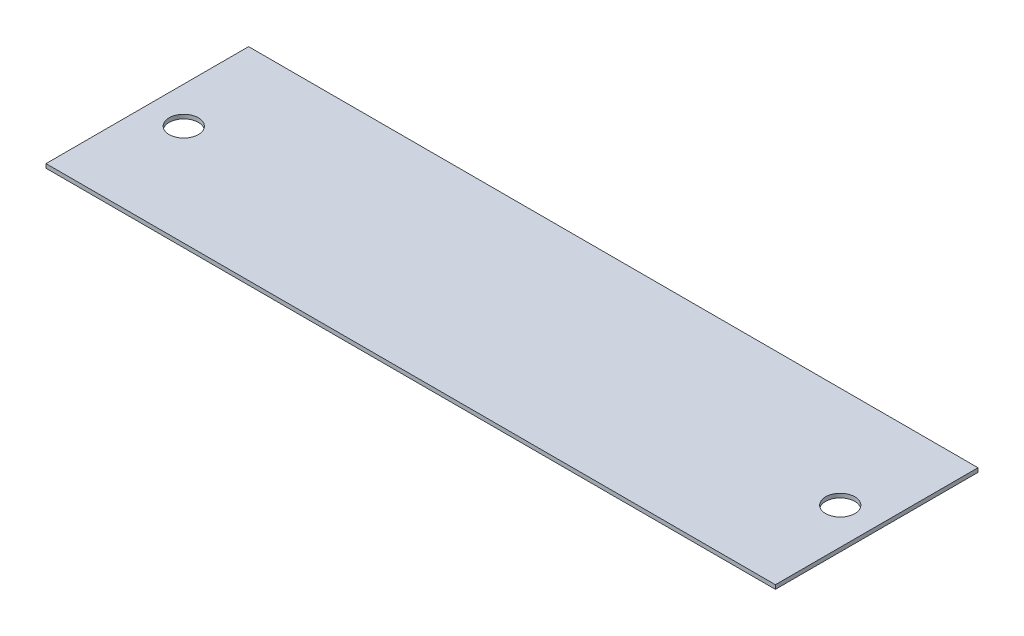
ISO-10303-21;
HEADER;
FILE_DESCRIPTION(('STEP AP214'),'2;1');
FILE_NAME('part.step','',(''),(''),'','','');
FILE_SCHEMA(('AUTOMOTIVE_DESIGN { 1 0 10303 214 1 1 1 1 }'));
ENDSEC;
DATA;
#1=APPLICATION_CONTEXT('core data for automotive mechanical design processes');
#2=APPLICATION_PROTOCOL_DEFINITION('international standard','automotive_design',2000,#1);
#3=PRODUCT_CONTEXT('',#1,'mechanical');
#4=PRODUCT('Part','Part','',(#3));
#5=PRODUCT_RELATED_PRODUCT_CATEGORY('part','',(#4));
#6=PRODUCT_DEFINITION_FORMATION('','',#4);
#7=PRODUCT_DEFINITION_CONTEXT('part definition',#1,'design');
#8=PRODUCT_DEFINITION('design','',#6,#7);
#9=PRODUCT_DEFINITION_SHAPE('','',#8);
#10=(LENGTH_UNIT() NAMED_UNIT(*) SI_UNIT(.MILLI.,.METRE.));
#11=(NAMED_UNIT(*) PLANE_ANGLE_UNIT() SI_UNIT($,.RADIAN.));
#12=(NAMED_UNIT(*) SI_UNIT($,.STERADIAN.) SOLID_ANGLE_UNIT());
#13=UNCERTAINTY_MEASURE_WITH_UNIT(LENGTH_MEASURE(1.E-05),#10,'distance_accuracy_value','');
#14=(GEOMETRIC_REPRESENTATION_CONTEXT(3) GLOBAL_UNCERTAINTY_ASSIGNED_CONTEXT((#13)) GLOBAL_UNIT_ASSIGNED_CONTEXT((#10,
#11,#12)) REPRESENTATION_CONTEXT('',''));
#15=CARTESIAN_POINT('',(0.,0.,0.));
#16=DIRECTION('',(0.,0.,1.));
#17=DIRECTION('',(1.,0.,0.));
#18=AXIS2_PLACEMENT_3D('',#15,#16,#17);
#19=CARTESIAN_POINT('',(45.,0.5,-12.5));
#20=DIRECTION('',(-1.,0.,0.));
#21=DIRECTION('',(0.,0.,1.));
#22=AXIS2_PLACEMENT_3D('',#19,#20,#21);
#23=PLANE('',#22);
#24=DIRECTION('',(0.,0.,-1.));
#25=VECTOR('',#24,1.);
#26=CARTESIAN_POINT('',(45.,0.,-12.5));
#27=LINE('',#26,#25);
#28=CARTESIAN_POINT('',(45.,0.,12.5));
#29=VERTEX_POINT('',#28);
#30=CARTESIAN_POINT('',(45.,0.,-12.5));
#31=VERTEX_POINT('',#30);
#32=EDGE_CURVE('E107',#29,#31,#27,.T.);
#33=ORIENTED_EDGE('',*,*,#32,.T.);
#34=DIRECTION('',(0.,-1.,0.));
#35=VECTOR('',#34,1.);
#36=CARTESIAN_POINT('',(45.,0.5,-12.5));
#37=LINE('',#36,#35);
#38=CARTESIAN_POINT('',(45.,0.5,-12.5));
#39=VERTEX_POINT('',#38);
#40=EDGE_CURVE('E11',#39,#31,#37,.T.);
#41=ORIENTED_EDGE('',*,*,#40,.F.);
#42=DIRECTION('',(0.,0.,-1.));
#43=VECTOR('',#42,1.);
#44=CARTESIAN_POINT('',(45.,0.5,-12.5));
#45=LINE('',#44,#43);
#46=CARTESIAN_POINT('',(45.,0.5,12.5));
#47=VERTEX_POINT('',#46);
#48=EDGE_CURVE('E91',#47,#39,#45,.T.);
#49=ORIENTED_EDGE('',*,*,#48,.F.);
#50=DIRECTION('',(0.,-1.,0.));
#51=VECTOR('',#50,1.);
#52=CARTESIAN_POINT('',(45.,0.5,12.5));
#53=LINE('',#52,#51);
#54=EDGE_CURVE('E103',#47,#29,#53,.T.);
#55=ORIENTED_EDGE('',*,*,#54,.T.);
#56=EDGE_LOOP('',(#33,#41,#49,#55));
#57=FACE_BOUND('',#56,.T.);
#58=ADVANCED_FACE('F39',(#57),#23,.F.);
#59=CARTESIAN_POINT('',(-45.,0.5,-12.5));
#60=DIRECTION('',(0.,0.,1.));
#61=DIRECTION('',(1.,0.,0.));
#62=AXIS2_PLACEMENT_3D('',#59,#60,#61);
#63=PLANE('',#62);
#64=DIRECTION('',(-1.,0.,0.));
#65=VECTOR('',#64,1.);
#66=CARTESIAN_POINT('',(-45.,0.,-12.5));
#67=LINE('',#66,#65);
#68=CARTESIAN_POINT('',(-45.,0.,-12.5));
#69=VERTEX_POINT('',#68);
#70=EDGE_CURVE('E96',#31,#69,#67,.T.);
#71=ORIENTED_EDGE('',*,*,#70,.T.);
#72=DIRECTION('',(0.,-1.,0.));
#73=VECTOR('',#72,1.);
#74=CARTESIAN_POINT('',(-45.,0.5,-12.5));
#75=LINE('',#74,#73);
#76=CARTESIAN_POINT('',(-45.,0.5,-12.5));
#77=VERTEX_POINT('',#76);
#78=EDGE_CURVE('E48',#77,#69,#75,.T.);
#79=ORIENTED_EDGE('',*,*,#78,.F.);
#80=DIRECTION('',(-1.,0.,0.));
#81=VECTOR('',#80,1.);
#82=CARTESIAN_POINT('',(-45.,0.5,-12.5));
#83=LINE('',#82,#81);
#84=EDGE_CURVE('E86',#39,#77,#83,.T.);
#85=ORIENTED_EDGE('',*,*,#84,.F.);
#86=ORIENTED_EDGE('',*,*,#40,.T.);
#87=EDGE_LOOP('',(#71,#79,#85,#86));
#88=FACE_BOUND('',#87,.T.);
#89=ADVANCED_FACE('F95',(#88),#63,.F.);
#90=CARTESIAN_POINT('',(-45.,0.5,-12.5));
#91=DIRECTION('',(1.,0.,0.));
#92=DIRECTION('',(0.,0.,-1.));
#93=AXIS2_PLACEMENT_3D('',#90,#91,#92);
#94=PLANE('',#93);
#95=DIRECTION('',(0.,0.,1.));
#96=VECTOR('',#95,1.);
#97=CARTESIAN_POINT('',(-45.,0.,-12.5));
#98=LINE('',#97,#96);
#99=CARTESIAN_POINT('',(-45.,0.,12.5));
#100=VERTEX_POINT('',#99);
#101=EDGE_CURVE('E73',#69,#100,#98,.T.);
#102=ORIENTED_EDGE('',*,*,#101,.T.);
#103=DIRECTION('',(0.,-1.,0.));
#104=VECTOR('',#103,1.);
#105=CARTESIAN_POINT('',(-45.,0.5,12.5));
#106=LINE('',#105,#104);
#107=CARTESIAN_POINT('',(-45.,0.5,12.5));
#108=VERTEX_POINT('',#107);
#109=EDGE_CURVE('E98',#108,#100,#106,.T.);
#110=ORIENTED_EDGE('',*,*,#109,.F.);
#111=DIRECTION('',(0.,0.,1.));
#112=VECTOR('',#111,1.);
#113=CARTESIAN_POINT('',(-45.,0.5,-12.5));
#114=LINE('',#113,#112);
#115=EDGE_CURVE('E89',#77,#108,#114,.T.);
#116=ORIENTED_EDGE('',*,*,#115,.F.);
#117=ORIENTED_EDGE('',*,*,#78,.T.);
#118=EDGE_LOOP('',(#102,#110,#116,#117));
#119=FACE_BOUND('',#118,.T.);
#120=ADVANCED_FACE('F99',(#119),#94,.F.);
#121=CARTESIAN_POINT('',(-45.,0.5,12.5));
#122=DIRECTION('',(0.,0.,-1.));
#123=DIRECTION('',(-1.,0.,0.));
#124=AXIS2_PLACEMENT_3D('',#121,#122,#123);
#125=PLANE('',#124);
#126=DIRECTION('',(1.,0.,0.));
#127=VECTOR('',#126,1.);
#128=CARTESIAN_POINT('',(-45.,0.,12.5));
#129=LINE('',#128,#127);
#130=EDGE_CURVE('E79',#100,#29,#129,.T.);
#131=ORIENTED_EDGE('',*,*,#130,.T.);
#132=ORIENTED_EDGE('',*,*,#54,.F.);
#133=DIRECTION('',(1.,0.,0.));
#134=VECTOR('',#133,1.);
#135=CARTESIAN_POINT('',(-45.,0.5,12.5));
#136=LINE('',#135,#134);
#137=EDGE_CURVE('E56',#108,#47,#136,.T.);
#138=ORIENTED_EDGE('',*,*,#137,.F.);
#139=ORIENTED_EDGE('',*,*,#109,.T.);
#140=EDGE_LOOP('',(#131,#132,#138,#139));
#141=FACE_BOUND('',#140,.T.);
#142=ADVANCED_FACE('F121',(#141),#125,.F.);
#143=CARTESIAN_POINT('',(0.,0.5,0.));
#144=DIRECTION('',(0.,1.,0.));
#145=DIRECTION('',(0.,0.,1.));
#146=AXIS2_PLACEMENT_3D('',#143,#144,#145);
#147=PLANE('',#146);
#148=CARTESIAN_POINT('',(-40.5,0.5,0.));
#149=DIRECTION('',(0.,1.,0.));
#150=DIRECTION('',(0.,0.,1.));
#151=AXIS2_PLACEMENT_3D('',#148,#149,#150);
#152=CIRCLE('',#151,1.8);
#153=CARTESIAN_POINT('',(-40.5,0.5,1.8));
#154=VERTEX_POINT('',#153);
#155=EDGE_CURVE('E132',#154,#154,#152,.T.);
#156=ORIENTED_EDGE('',*,*,#155,.F.);
#157=EDGE_LOOP('',(#156));
#158=FACE_BOUND('',#157,.T.);
#159=CARTESIAN_POINT('',(40.5,0.5,0.));
#160=DIRECTION('',(0.,1.,0.));
#161=DIRECTION('',(0.,0.,1.));
#162=AXIS2_PLACEMENT_3D('',#159,#160,#161);
#163=CIRCLE('',#162,1.8);
#164=CARTESIAN_POINT('',(40.5,0.5,1.8));
#165=VERTEX_POINT('',#164);
#166=EDGE_CURVE('E133',#165,#165,#163,.T.);
#167=ORIENTED_EDGE('',*,*,#166,.F.);
#168=EDGE_LOOP('',(#167));
#169=FACE_BOUND('',#168,.T.);
#170=ORIENTED_EDGE('',*,*,#48,.T.);
#171=ORIENTED_EDGE('',*,*,#84,.T.);
#172=ORIENTED_EDGE('',*,*,#115,.T.);
#173=ORIENTED_EDGE('',*,*,#137,.T.);
#174=EDGE_LOOP('',(#170,#171,#172,#173));
#175=FACE_BOUND('',#174,.T.);
#176=ADVANCED_FACE('F87',(#158,#169,#175),#147,.T.);
#177=CARTESIAN_POINT('',(0.,0.,0.));
#178=DIRECTION('',(0.,1.,0.));
#179=DIRECTION('',(0.,0.,1.));
#180=AXIS2_PLACEMENT_3D('',#177,#178,#179);
#181=PLANE('',#180);
#182=CARTESIAN_POINT('',(-40.5,0.,0.));
#183=DIRECTION('',(0.,1.,0.));
#184=DIRECTION('',(0.,0.,1.));
#185=AXIS2_PLACEMENT_3D('',#182,#183,#184);
#186=CIRCLE('',#185,1.8);
#187=CARTESIAN_POINT('',(-40.5,0.,1.8));
#188=VERTEX_POINT('',#187);
#189=EDGE_CURVE('E111',#188,#188,#186,.F.);
#190=ORIENTED_EDGE('',*,*,#189,.F.);
#191=EDGE_LOOP('',(#190));
#192=FACE_BOUND('',#191,.T.);
#193=CARTESIAN_POINT('',(40.5,0.,0.));
#194=DIRECTION('',(0.,1.,0.));
#195=DIRECTION('',(0.,0.,1.));
#196=AXIS2_PLACEMENT_3D('',#193,#194,#195);
#197=CIRCLE('',#196,1.8);
#198=CARTESIAN_POINT('',(40.5,0.,1.8));
#199=VERTEX_POINT('',#198);
#200=EDGE_CURVE('E128',#199,#199,#197,.F.);
#201=ORIENTED_EDGE('',*,*,#200,.F.);
#202=EDGE_LOOP('',(#201));
#203=FACE_BOUND('',#202,.T.);
#204=ORIENTED_EDGE('',*,*,#32,.F.);
#205=ORIENTED_EDGE('',*,*,#130,.F.);
#206=ORIENTED_EDGE('',*,*,#101,.F.);
#207=ORIENTED_EDGE('',*,*,#70,.F.);
#208=EDGE_LOOP('',(#204,#205,#206,#207));
#209=FACE_BOUND('',#208,.T.);
#210=ADVANCED_FACE('F124',(#192,#203,#209),#181,.F.);
#211=CARTESIAN_POINT('',(40.5,-5.09116882454315,0.));
#212=DIRECTION('',(0.,1.,0.));
#213=DIRECTION('',(0.,0.,1.));
#214=AXIS2_PLACEMENT_3D('',#211,#212,#213);
#215=CYLINDRICAL_SURFACE('',#214,1.8);
#216=CARTESIAN_POINT('',(40.5,0.,1.8));
#217=CARTESIAN_POINT('',(40.5,0.00520833333333246,1.8));
#218=CARTESIAN_POINT('',(40.5,0.0104166666666658,1.8));
#219=CARTESIAN_POINT('',(40.5,0.0208333333333325,1.8));
#220=CARTESIAN_POINT('',(40.5,0.0260416666666658,1.8));
#221=CARTESIAN_POINT('',(40.5,0.0364583333333325,1.8));
#222=CARTESIAN_POINT('',(40.5,0.0416666666666658,1.8));
#223=CARTESIAN_POINT('',(40.5,0.0520833333333325,1.8));
#224=CARTESIAN_POINT('',(40.5,0.0572916666666659,1.8));
#225=CARTESIAN_POINT('',(40.5,0.0677083333333325,1.8));
#226=CARTESIAN_POINT('',(40.5,0.0729166666666659,1.8));
#227=CARTESIAN_POINT('',(40.5,0.0833333333333325,1.8));
#228=CARTESIAN_POINT('',(40.5,0.0885416666666659,1.8));
#229=CARTESIAN_POINT('',(40.5,0.0989583333333326,1.8));
#230=CARTESIAN_POINT('',(40.5,0.104166666666666,1.8));
#231=CARTESIAN_POINT('',(40.5,0.114583333333333,1.8));
#232=CARTESIAN_POINT('',(40.5,0.119791666666666,1.8));
#233=CARTESIAN_POINT('',(40.5,0.130208333333333,1.8));
#234=CARTESIAN_POINT('',(40.5,0.135416666666666,1.8));
#235=CARTESIAN_POINT('',(40.5,0.145833333333333,1.8));
#236=CARTESIAN_POINT('',(40.5,0.151041666666666,1.8));
#237=CARTESIAN_POINT('',(40.5,0.161458333333333,1.8));
#238=CARTESIAN_POINT('',(40.5,0.166666666666666,1.8));
#239=CARTESIAN_POINT('',(40.5,0.177083333333333,1.8));
#240=CARTESIAN_POINT('',(40.5,0.182291666666666,1.8));
#241=CARTESIAN_POINT('',(40.5,0.192708333333333,1.8));
#242=CARTESIAN_POINT('',(40.5,0.197916666666666,1.8));
#243=CARTESIAN_POINT('',(40.5,0.208333333333333,1.8));
#244=CARTESIAN_POINT('',(40.5,0.213541666666666,1.8));
#245=CARTESIAN_POINT('',(40.5,0.223958333333333,1.8));
#246=CARTESIAN_POINT('',(40.5,0.229166666666666,1.8));
#247=CARTESIAN_POINT('',(40.5,0.239583333333333,1.8));
#248=CARTESIAN_POINT('',(40.5,0.244791666666666,1.8));
#249=CARTESIAN_POINT('',(40.5,0.255208333333333,1.8));
#250=CARTESIAN_POINT('',(40.5,0.260416666666666,1.8));
#251=CARTESIAN_POINT('',(40.5,0.270833333333333,1.8));
#252=CARTESIAN_POINT('',(40.5,0.276041666666666,1.8));
#253=CARTESIAN_POINT('',(40.5,0.286458333333333,1.8));
#254=CARTESIAN_POINT('',(40.5,0.291666666666666,1.8));
#255=CARTESIAN_POINT('',(40.5,0.302083333333333,1.8));
#256=CARTESIAN_POINT('',(40.5,0.307291666666666,1.8));
#257=CARTESIAN_POINT('',(40.5,0.317708333333333,1.8));
#258=CARTESIAN_POINT('',(40.5,0.322916666666666,1.8));
#259=CARTESIAN_POINT('',(40.5,0.333333333333333,1.8));
#260=CARTESIAN_POINT('',(40.5,0.338541666666666,1.8));
#261=CARTESIAN_POINT('',(40.5,0.348958333333333,1.8));
#262=CARTESIAN_POINT('',(40.5,0.354166666666666,1.8));
#263=CARTESIAN_POINT('',(40.5,0.364583333333333,1.8));
#264=CARTESIAN_POINT('',(40.5,0.369791666666666,1.8));
#265=CARTESIAN_POINT('',(40.5,0.380208333333333,1.8));
#266=CARTESIAN_POINT('',(40.5,0.385416666666666,1.8));
#267=CARTESIAN_POINT('',(40.5,0.395833333333333,1.8));
#268=CARTESIAN_POINT('',(40.5,0.401041666666666,1.8));
#269=CARTESIAN_POINT('',(40.5,0.411458333333333,1.8));
#270=CARTESIAN_POINT('',(40.5,0.416666666666666,1.8));
#271=CARTESIAN_POINT('',(40.5,0.427083333333333,1.8));
#272=CARTESIAN_POINT('',(40.5,0.432291666666666,1.8));
#273=CARTESIAN_POINT('',(40.5,0.442708333333333,1.8));
#274=CARTESIAN_POINT('',(40.5,0.447916666666666,1.8));
#275=CARTESIAN_POINT('',(40.5,0.458333333333333,1.8));
#276=CARTESIAN_POINT('',(40.5,0.463541666666666,1.8));
#277=CARTESIAN_POINT('',(40.5,0.473958333333333,1.8));
#278=CARTESIAN_POINT('',(40.5,0.479166666666666,1.8));
#279=CARTESIAN_POINT('',(40.5,0.489583333333333,1.8));
#280=CARTESIAN_POINT('',(40.5,0.494791666666666,1.8));
#281=CARTESIAN_POINT('',(40.5,0.5,1.8));
#282=B_SPLINE_CURVE_WITH_KNOTS('',3,(#216,#217,#218,#219,#220,#221,#222,#223,#224,#225,#226,
#227,#228,#229,#230,#231,#232,#233,#234,#235,#236,#237,#238,#239,#240,#241,#242,#243,#244,#245,
#246,#247,#248,#249,#250,#251,#252,#253,#254,#255,#256,#257,#258,#259,#260,#261,#262,#263,#264,
#265,#266,#267,#268,#269,#270,#271,#272,#273,#274,#275,#276,#277,#278,#279,#280,#281),
.UNSPECIFIED.,.F.,.F.,(4,2,2,2,2,2,2,2,2,2,2,2,2,2,2,2,2,2,2,2,2,2,2,2,2,2,2,2,2,2,2,2,4),(0.,
0.015625,0.03125,0.046875,0.0625000000000001,0.0781250000000001,0.0937500000000001,0.109375,
0.125,0.140625,0.15625,0.171875,0.1875,0.203125,0.21875,0.234375,0.25,0.265625,0.28125,0.296875,
0.3125,0.328125,0.34375,0.359375,0.375,0.390625,0.40625,0.421875,0.4375,0.453125,0.46875,
0.484375,0.5),.UNSPECIFIED.);
#283=EDGE_CURVE('BSEAM151',#199,#165,#282,.T.);
#284=ORIENTED_EDGE('',*,*,#200,.T.);
#285=ORIENTED_EDGE('',*,*,#166,.T.);
#286=ORIENTED_EDGE('',*,*,#283,.T.);
#287=ORIENTED_EDGE('',*,*,#283,.F.);
#288=EDGE_LOOP('',(#284,#286,#285,#287));
#289=FACE_BOUND('',#288,.T.);
#290=ADVANCED_FACE('F151',(#289),#215,.F.);
#291=CARTESIAN_POINT('',(-40.5,-5.09116882454315,0.));
#292=DIRECTION('',(0.,1.,0.));
#293=DIRECTION('',(0.,0.,1.));
#294=AXIS2_PLACEMENT_3D('',#291,#292,#293);
#295=CYLINDRICAL_SURFACE('',#294,1.8);
#296=CARTESIAN_POINT('',(-40.5,0.,1.8));
#297=CARTESIAN_POINT('',(-40.5,0.00520833333333246,1.8));
#298=CARTESIAN_POINT('',(-40.5,0.0104166666666658,1.8));
#299=CARTESIAN_POINT('',(-40.5,0.0208333333333325,1.8));
#300=CARTESIAN_POINT('',(-40.5,0.0260416666666658,1.8));
#301=CARTESIAN_POINT('',(-40.5,0.0364583333333325,1.8));
#302=CARTESIAN_POINT('',(-40.5,0.0416666666666658,1.8));
#303=CARTESIAN_POINT('',(-40.5,0.0520833333333325,1.8));
#304=CARTESIAN_POINT('',(-40.5,0.0572916666666659,1.8));
#305=CARTESIAN_POINT('',(-40.5,0.0677083333333325,1.8));
#306=CARTESIAN_POINT('',(-40.5,0.0729166666666659,1.8));
#307=CARTESIAN_POINT('',(-40.5,0.0833333333333325,1.8));
#308=CARTESIAN_POINT('',(-40.5,0.0885416666666659,1.8));
#309=CARTESIAN_POINT('',(-40.5,0.0989583333333326,1.8));
#310=CARTESIAN_POINT('',(-40.5,0.104166666666666,1.8));
#311=CARTESIAN_POINT('',(-40.5,0.114583333333333,1.8));
#312=CARTESIAN_POINT('',(-40.5,0.119791666666666,1.8));
#313=CARTESIAN_POINT('',(-40.5,0.130208333333333,1.8));
#314=CARTESIAN_POINT('',(-40.5,0.135416666666666,1.8));
#315=CARTESIAN_POINT('',(-40.5,0.145833333333333,1.8));
#316=CARTESIAN_POINT('',(-40.5,0.151041666666666,1.8));
#317=CARTESIAN_POINT('',(-40.5,0.161458333333333,1.8));
#318=CARTESIAN_POINT('',(-40.5,0.166666666666666,1.8));
#319=CARTESIAN_POINT('',(-40.5,0.177083333333333,1.8));
#320=CARTESIAN_POINT('',(-40.5,0.182291666666666,1.8));
#321=CARTESIAN_POINT('',(-40.5,0.192708333333333,1.8));
#322=CARTESIAN_POINT('',(-40.5,0.197916666666666,1.8));
#323=CARTESIAN_POINT('',(-40.5,0.208333333333333,1.8));
#324=CARTESIAN_POINT('',(-40.5,0.213541666666666,1.8));
#325=CARTESIAN_POINT('',(-40.5,0.223958333333333,1.8));
#326=CARTESIAN_POINT('',(-40.5,0.229166666666666,1.8));
#327=CARTESIAN_POINT('',(-40.5,0.239583333333333,1.8));
#328=CARTESIAN_POINT('',(-40.5,0.244791666666666,1.8));
#329=CARTESIAN_POINT('',(-40.5,0.255208333333333,1.8));
#330=CARTESIAN_POINT('',(-40.5,0.260416666666666,1.8));
#331=CARTESIAN_POINT('',(-40.5,0.270833333333333,1.8));
#332=CARTESIAN_POINT('',(-40.5,0.276041666666666,1.8));
#333=CARTESIAN_POINT('',(-40.5,0.286458333333333,1.8));
#334=CARTESIAN_POINT('',(-40.5,0.291666666666666,1.8));
#335=CARTESIAN_POINT('',(-40.5,0.302083333333333,1.8));
#336=CARTESIAN_POINT('',(-40.5,0.307291666666666,1.8));
#337=CARTESIAN_POINT('',(-40.5,0.317708333333333,1.8));
#338=CARTESIAN_POINT('',(-40.5,0.322916666666666,1.8));
#339=CARTESIAN_POINT('',(-40.5,0.333333333333333,1.8));
#340=CARTESIAN_POINT('',(-40.5,0.338541666666666,1.8));
#341=CARTESIAN_POINT('',(-40.5,0.348958333333333,1.8));
#342=CARTESIAN_POINT('',(-40.5,0.354166666666666,1.8));
#343=CARTESIAN_POINT('',(-40.5,0.364583333333333,1.8));
#344=CARTESIAN_POINT('',(-40.5,0.369791666666666,1.8));
#345=CARTESIAN_POINT('',(-40.5,0.380208333333333,1.8));
#346=CARTESIAN_POINT('',(-40.5,0.385416666666666,1.8));
#347=CARTESIAN_POINT('',(-40.5,0.395833333333333,1.8));
#348=CARTESIAN_POINT('',(-40.5,0.401041666666666,1.8));
#349=CARTESIAN_POINT('',(-40.5,0.411458333333333,1.8));
#350=CARTESIAN_POINT('',(-40.5,0.416666666666666,1.8));
#351=CARTESIAN_POINT('',(-40.5,0.427083333333333,1.8));
#352=CARTESIAN_POINT('',(-40.5,0.432291666666666,1.8));
#353=CARTESIAN_POINT('',(-40.5,0.442708333333333,1.8));
#354=CARTESIAN_POINT('',(-40.5,0.447916666666666,1.8));
#355=CARTESIAN_POINT('',(-40.5,0.458333333333333,1.8));
#356=CARTESIAN_POINT('',(-40.5,0.463541666666666,1.8));
#357=CARTESIAN_POINT('',(-40.5,0.473958333333333,1.8));
#358=CARTESIAN_POINT('',(-40.5,0.479166666666666,1.8));
#359=CARTESIAN_POINT('',(-40.5,0.489583333333333,1.8));
#360=CARTESIAN_POINT('',(-40.5,0.494791666666666,1.8));
#361=CARTESIAN_POINT('',(-40.5,0.5,1.8));
#362=B_SPLINE_CURVE_WITH_KNOTS('',3,(#296,#297,#298,#299,#300,#301,#302,#303,#304,#305,#306,
#307,#308,#309,#310,#311,#312,#313,#314,#315,#316,#317,#318,#319,#320,#321,#322,#323,#324,#325,
#326,#327,#328,#329,#330,#331,#332,#333,#334,#335,#336,#337,#338,#339,#340,#341,#342,#343,#344,
#345,#346,#347,#348,#349,#350,#351,#352,#353,#354,#355,#356,#357,#358,#359,#360,#361),
.UNSPECIFIED.,.F.,.F.,(4,2,2,2,2,2,2,2,2,2,2,2,2,2,2,2,2,2,2,2,2,2,2,2,2,2,2,2,2,2,2,2,4),(0.,
0.015625,0.03125,0.046875,0.0625000000000001,0.0781250000000001,0.0937500000000001,0.109375,
0.125,0.140625,0.15625,0.171875,0.1875,0.203125,0.21875,0.234375,0.25,0.265625,0.28125,0.296875,
0.3125,0.328125,0.34375,0.359375,0.375,0.390625,0.40625,0.421875,0.4375,0.453125,0.46875,
0.484375,0.5),.UNSPECIFIED.);
#363=EDGE_CURVE('BSEAM144',#188,#154,#362,.T.);
#364=ORIENTED_EDGE('',*,*,#189,.T.);
#365=ORIENTED_EDGE('',*,*,#155,.T.);
#366=ORIENTED_EDGE('',*,*,#363,.T.);
#367=ORIENTED_EDGE('',*,*,#363,.F.);
#368=EDGE_LOOP('',(#364,#366,#365,#367));
#369=FACE_BOUND('',#368,.T.);
#370=ADVANCED_FACE('F144',(#369),#295,.F.);
#371=CLOSED_SHELL('',(#58,#89,#120,#142,#176,#210,#290,#370));
#372=MANIFOLD_SOLID_BREP('B2',#371);
#373=ADVANCED_BREP_SHAPE_REPRESENTATION('',(#18,#372),#14);
#374=SHAPE_DEFINITION_REPRESENTATION(#9,#373);
ENDSEC;
END-ISO-10303-21;
